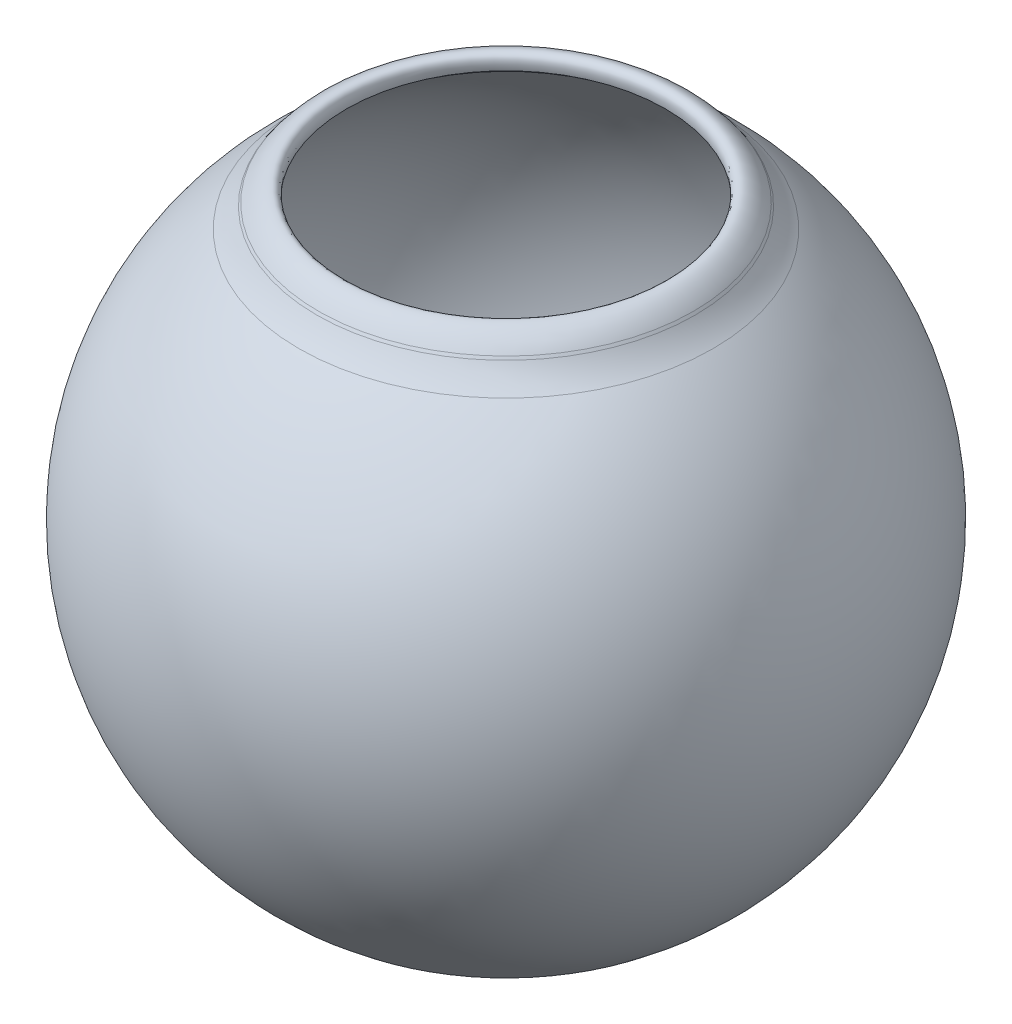
ISO-10303-21;
HEADER;
FILE_DESCRIPTION(('STEP AP214'),'2;1');
FILE_NAME('part.step','',(''),(''),'','','');
FILE_SCHEMA(('AUTOMOTIVE_DESIGN { 1 0 10303 214 1 1 1 1 }'));
ENDSEC;
DATA;
#1=APPLICATION_CONTEXT('core data for automotive mechanical design processes');
#2=APPLICATION_PROTOCOL_DEFINITION('international standard','automotive_design',2000,#1);
#3=PRODUCT_CONTEXT('',#1,'mechanical');
#4=PRODUCT('Part','Part','',(#3));
#5=PRODUCT_RELATED_PRODUCT_CATEGORY('part','',(#4));
#6=PRODUCT_DEFINITION_FORMATION('','',#4);
#7=PRODUCT_DEFINITION_CONTEXT('part definition',#1,'design');
#8=PRODUCT_DEFINITION('design','',#6,#7);
#9=PRODUCT_DEFINITION_SHAPE('','',#8);
#10=(LENGTH_UNIT() NAMED_UNIT(*) SI_UNIT(.MILLI.,.METRE.));
#11=(NAMED_UNIT(*) PLANE_ANGLE_UNIT() SI_UNIT($,.RADIAN.));
#12=(NAMED_UNIT(*) SI_UNIT($,.STERADIAN.) SOLID_ANGLE_UNIT());
#13=UNCERTAINTY_MEASURE_WITH_UNIT(LENGTH_MEASURE(1.E-05),#10,'distance_accuracy_value','');
#14=(GEOMETRIC_REPRESENTATION_CONTEXT(3) GLOBAL_UNCERTAINTY_ASSIGNED_CONTEXT((#13)) GLOBAL_UNIT_ASSIGNED_CONTEXT((#10,
#11,#12)) REPRESENTATION_CONTEXT('',''));
#15=CARTESIAN_POINT('',(0.,0.,0.));
#16=DIRECTION('',(0.,0.,1.));
#17=DIRECTION('',(1.,0.,0.));
#18=AXIS2_PLACEMENT_3D('',#15,#16,#17);
#19=CARTESIAN_POINT('',(5.54815363193916,4.33606060606061,0.));
#20=CARTESIAN_POINT('',(5.40298248991348,5.04493347683729,0.));
#21=CARTESIAN_POINT('',(6.05134321620451,4.92625791000506,0.));
#22=CARTESIAN_POINT('',(6.52085883914075,4.28,0.));
#23=B_SPLINE_CURVE_WITH_KNOTS('',3,(#19,#20,#21,#22),.UNSPECIFIED.,.F.,.F.,(4,4),(0.,1.),.UNSPECIFIED.);
#24=CARTESIAN_POINT('',(0.,6.398313168269,0.));
#25=DIRECTION('',(0.,1.,0.));
#26=AXIS1_PLACEMENT('',#24,#25);
#27=SURFACE_OF_REVOLUTION('',#23,#26);
#28=CARTESIAN_POINT('',(0.,4.28,0.));
#29=DIRECTION('',(0.,1.,0.));
#30=DIRECTION('',(0.,0.,1.));
#31=AXIS2_PLACEMENT_3D('',#28,#29,#30);
#32=CIRCLE('',#31,6.52085883914075);
#33=CARTESIAN_POINT('',(6.52085883914075,4.28,0.));
#34=VERTEX_POINT('',#33);
#35=EDGE_CURVE('E56',#34,#34,#32,.T.);
#36=ORIENTED_EDGE('',*,*,#35,.T.);
#37=EDGE_LOOP('',(#36));
#38=FACE_BOUND('',#37,.T.);
#39=CARTESIAN_POINT('',(0.,4.33606060606061,0.));
#40=DIRECTION('',(0.,1.,0.));
#41=DIRECTION('',(0.,0.,1.));
#42=AXIS2_PLACEMENT_3D('',#39,#40,#41);
#43=CIRCLE('',#42,5.54815363193916);
#44=CARTESIAN_POINT('',(0.,4.33606060606061,5.54815363193916));
#45=VERTEX_POINT('',#44);
#46=EDGE_CURVE('E10',#45,#45,#43,.T.);
#47=ORIENTED_EDGE('',*,*,#46,.F.);
#48=EDGE_LOOP('',(#47));
#49=FACE_BOUND('',#48,.T.);
#50=ADVANCED_FACE('F33',(#38,#49),#27,.F.);
#51=CARTESIAN_POINT('',(0.,4.33606060606061,0.));
#52=DIRECTION('',(0.,-1.,0.));
#53=DIRECTION('',(0.,0.,-1.));
#54=AXIS2_PLACEMENT_3D('',#51,#52,#53);
#55=CONICAL_SURFACE('',#54,5.54815363193916,0.92242128572847);
#56=CARTESIAN_POINT('',(0.,4.07999999999923,0.));
#57=DIRECTION('',(0.,1.,0.));
#58=DIRECTION('',(0.,0.,1.));
#59=AXIS2_PLACEMENT_3D('',#56,#57,#58);
#60=CIRCLE('',#59,5.8861234016712);
#61=CARTESIAN_POINT('',(0.,4.07999999999923,5.8861234016712));
#62=VERTEX_POINT('',#61);
#63=EDGE_CURVE('E40',#62,#62,#60,.T.);
#64=ORIENTED_EDGE('',*,*,#63,.F.);
#65=EDGE_LOOP('',(#64));
#66=FACE_BOUND('',#65,.T.);
#67=ORIENTED_EDGE('',*,*,#46,.T.);
#68=EDGE_LOOP('',(#67));
#69=FACE_BOUND('',#68,.T.);
#70=ADVANCED_FACE('F91',(#66,#69),#55,.F.);
#71=CARTESIAN_POINT('',(0.,4.07999999999923,0.));
#72=DIRECTION('',(0.,-1.,0.));
#73=DIRECTION('',(0.,0.,-1.));
#74=AXIS2_PLACEMENT_3D('',#71,#72,#73);
#75=CONICAL_SURFACE('',#74,5.8861234016712,0.976703062621491);
#76=CARTESIAN_POINT('',(0.,3.69256208874024,0.));
#77=DIRECTION('',(0.,1.,0.));
#78=DIRECTION('',(0.,0.,1.));
#79=AXIS2_PLACEMENT_3D('',#76,#77,#78);
#80=CIRCLE('',#79,6.45968041012119);
#81=CARTESIAN_POINT('',(0.,3.69256208874024,6.45968041012119));
#82=VERTEX_POINT('',#81);
#83=EDGE_CURVE('E44',#82,#82,#80,.T.);
#84=ORIENTED_EDGE('',*,*,#83,.F.);
#85=EDGE_LOOP('',(#84));
#86=FACE_BOUND('',#85,.T.);
#87=ORIENTED_EDGE('',*,*,#63,.T.);
#88=EDGE_LOOP('',(#87));
#89=FACE_BOUND('',#88,.T.);
#90=ADVANCED_FACE('F87',(#86,#89),#75,.F.);
#91=CARTESIAN_POINT('',(0.,-5.20489802409883,0.));
#92=DIRECTION('',(0.,1.,0.));
#93=DIRECTION('',(1.,0.,0.));
#94=AXIS2_PLACEMENT_3D('',#91,#92,#93);
#95=SPHERICAL_SURFACE('',#94,10.9951019759012);
#96=ORIENTED_EDGE('',*,*,#83,.T.);
#97=EDGE_LOOP('',(#96));
#98=FACE_BOUND('',#97,.T.);
#99=ADVANCED_FACE('F82',(#98),#95,.F.);
#100=CARTESIAN_POINT('',(0.,-5.22,0.));
#101=DIRECTION('',(0.,1.,0.));
#102=DIRECTION('',(-1.,0.,0.));
#103=AXIS2_PLACEMENT_3D('',#100,#101,#102);
#104=SPHERICAL_SURFACE('',#103,11.3);
#105=CARTESIAN_POINT('',(0.,3.49186614152132,0.));
#106=DIRECTION('',(0.,1.,0.));
#107=DIRECTION('',(0.,0.,1.));
#108=AXIS2_PLACEMENT_3D('',#105,#106,#107);
#109=CIRCLE('',#108,7.19676235068343);
#110=CARTESIAN_POINT('',(0.,3.49186614152132,7.19676235068343));
#111=VERTEX_POINT('',#110);
#112=EDGE_CURVE('E48',#111,#111,#109,.T.);
#113=ORIENTED_EDGE('',*,*,#112,.F.);
#114=EDGE_LOOP('',(#113));
#115=FACE_BOUND('',#114,.T.);
#116=ADVANCED_FACE('F77',(#115),#104,.T.);
#117=CARTESIAN_POINT('',(0.,5.80475095785442,0.));
#118=DIRECTION('',(0.,1.,0.));
#119=DIRECTION('',(0.,0.,1.));
#120=AXIS2_PLACEMENT_3D('',#117,#118,#119);
#121=TOROIDAL_SURFACE('',#120,9.10740722254628,3.);
#122=CARTESIAN_POINT('',(0.,4.19232013622819,0.));
#123=DIRECTION('',(0.,1.,0.));
#124=DIRECTION('',(0.,0.,1.));
#125=AXIS2_PLACEMENT_3D('',#122,#123,#124);
#126=CIRCLE('',#125,6.57757188295009);
#127=CARTESIAN_POINT('',(6.57757188295009,4.19232013622819,0.));
#128=VERTEX_POINT('',#127);
#129=EDGE_CURVE('E53',#128,#128,#126,.T.);
#130=ORIENTED_EDGE('',*,*,#129,.F.);
#131=EDGE_LOOP('',(#130));
#132=FACE_BOUND('',#131,.T.);
#133=ORIENTED_EDGE('',*,*,#112,.T.);
#134=EDGE_LOOP('',(#133));
#135=FACE_BOUND('',#134,.T.);
#136=ADVANCED_FACE('F71',(#132,#135),#121,.F.);
#137=CARTESIAN_POINT('',(0.,0.,0.));
#138=DIRECTION('',(0.,1.,0.));
#139=DIRECTION('',(1.,0.,0.));
#140=AXIS2_PLACEMENT_3D('',#137,#138,#139);
#141=SPHERICAL_SURFACE('',#140,7.8);
#142=CARTESIAN_POINT('',(6.52085883914075,4.28,0.));
#143=CARTESIAN_POINT('',(6.52145570487089,4.27909063617475,0.));
#144=CARTESIAN_POINT('',(6.52205238037854,4.27818114749597,0.));
#145=CARTESIAN_POINT('',(6.52324535084448,4.27636192059057,0.));
#146=CARTESIAN_POINT('',(6.52384164580277,4.27545218236395,0.));
#147=CARTESIAN_POINT('',(6.5250338550656,4.27363245652209,0.));
#148=CARTESIAN_POINT('',(6.52562976937015,4.27272246890684,0.));
#149=CARTESIAN_POINT('',(6.5268212172212,4.27090224444701,0.));
#150=CARTESIAN_POINT('',(6.5274167507677,4.26999200760242,0.));
#151=CARTESIAN_POINT('',(6.52860743699842,4.26817128484321,0.));
#152=CARTESIAN_POINT('',(6.52920258968265,4.26726079892859,0.));
#153=CARTESIAN_POINT('',(6.53039251408465,4.26543957818869,0.));
#154=CARTESIAN_POINT('',(6.53098728580242,4.2645288433634,0.));
#155=CARTESIAN_POINT('',(6.53217644816743,4.26270712496156,0.));
#156=CARTESIAN_POINT('',(6.53277083881466,4.26179614138501,0.));
#157=CARTESIAN_POINT('',(6.53395923893453,4.25997392564009,0.));
#158=CARTESIAN_POINT('',(6.53455324840717,4.25906269347172,0.));
#159=CARTESIAN_POINT('',(6.5357408860739,4.25723998070266,0.));
#160=CARTESIAN_POINT('',(6.53633451426799,4.25632850010197,0.));
#161=CARTESIAN_POINT('',(6.53752138927372,4.25450529062779,0.));
#162=CARTESIAN_POINT('',(6.53811463608536,4.25359356175431,0.));
#163=CARTESIAN_POINT('',(6.53930074822234,4.25176985589413,0.));
#164=CARTESIAN_POINT('',(6.53989361354769,4.25085787890744,0.));
#165=CARTESIAN_POINT('',(6.54107896260832,4.24903367698046,0.));
#166=CARTESIAN_POINT('',(6.54167144634361,4.24812145204018,0.));
#167=CARTESIAN_POINT('',(6.54285603212043,4.24629675436569,0.));
#168=CARTESIAN_POINT('',(6.54344813416196,4.24538428163148,0.));
#169=CARTESIAN_POINT('',(6.54463195644763,4.24355908852885,0.));
#170=CARTESIAN_POINT('',(6.54522367669176,4.24264636816042,0.));
#171=CARTESIAN_POINT('',(6.54640673527908,4.24082067994911,0.));
#172=CARTESIAN_POINT('',(6.54699807362225,4.23990771210622,0.));
#173=CARTESIAN_POINT('',(6.54818036830414,4.23808152910577,0.));
#174=CARTESIAN_POINT('',(6.54877132464285,4.23716831394822,0.));
#175=CARTESIAN_POINT('',(6.54995285521238,4.23534163647827,0.));
#176=CARTESIAN_POINT('',(6.5505434294432,4.23442817416588,0.));
#177=CARTESIAN_POINT('',(6.55172419569357,4.23260100254616,0.));
#178=CARTESIAN_POINT('',(6.55231438771312,4.23168729323882,0.));
#179=CARTESIAN_POINT('',(6.55349438943766,4.22985962778912,0.));
#180=CARTESIAN_POINT('',(6.55408419914265,4.22894567164676,0.));
#181=CARTESIAN_POINT('',(6.55526343613483,4.22711751268699,0.));
#182=CARTESIAN_POINT('',(6.55585286342203,4.22620330986957,0.));
#183=CARTESIAN_POINT('',(6.55703133547545,4.22437465771969,0.));
#184=CARTESIAN_POINT('',(6.55762038024167,4.22346020838723,0.));
#185=CARTESIAN_POINT('',(6.55879808715007,4.22163106336732,0.));
#186=CARTESIAN_POINT('',(6.55938674929223,4.22071636767987,0.));
#187=CARTESIAN_POINT('',(6.56056369084946,4.21888673011008,0.));
#188=CARTESIAN_POINT('',(6.56115197026453,4.21797178822774,0.));
#189=CARTESIAN_POINT('',(6.56232814626461,4.2161416584283,0.));
#190=CARTESIAN_POINT('',(6.56291604284962,4.21522647051121,0.));
#191=CARTESIAN_POINT('',(6.56409145308668,4.21339584880245,0.));
#192=CARTESIAN_POINT('',(6.56467896673872,4.21248041501079,0.));
#193=CARTESIAN_POINT('',(6.56585361100703,4.21064930171313,0.));
#194=CARTESIAN_POINT('',(6.56644074162328,4.20973362220713,0.));
#195=CARTESIAN_POINT('',(6.56761461971724,4.20790201764105,0.));
#196=CARTESIAN_POINT('',(6.56820136719494,4.20698609258098,0.));
#197=CARTESIAN_POINT('',(6.56937447890909,4.20515399706708,0.));
#198=CARTESIAN_POINT('',(6.56996084314554,4.20423782661324,0.));
#199=CARTESIAN_POINT('',(6.57113318827455,4.20240524047218,0.));
#200=CARTESIAN_POINT('',(6.57171916916711,4.20148882478495,0.));
#201=CARTESIAN_POINT('',(6.5728907475058,4.19965574833747,0.));
#202=CARTESIAN_POINT('',(6.57347634495191,4.19873908757724,0.));
#203=CARTESIAN_POINT('',(6.5746471562952,4.1969055211442,0.));
#204=CARTESIAN_POINT('',(6.57523237019238,4.1959886154714,0.));
#205=CARTESIAN_POINT('',(6.57640241433536,4.19415455937372,0.));
#206=CARTESIAN_POINT('',(6.57698724458117,4.19323740894885,0.));
#207=CARTESIAN_POINT('',(6.57757188295009,4.19232013622819,0.));
#208=B_SPLINE_CURVE_WITH_KNOTS('',3,(#142,#143,#144,#145,#146,#147,#148,#149,#150,#151,#152,
#153,#154,#155,#156,#157,#158,#159,#160,#161,#162,#163,#164,#165,#166,#167,#168,#169,#170,#171,
#172,#173,#174,#175,#176,#177,#178,#179,#180,#181,#182,#183,#184,#185,#186,#187,#188,#189,#190,
#191,#192,#193,#194,#195,#196,#197,#198,#199,#200,#201,#202,#203,#204,#205,#206,#207),
.UNSPECIFIED.,.F.,.F.,(4,2,2,2,2,2,2,2,2,2,2,2,2,2,2,2,2,2,2,2,2,2,2,2,2,2,2,2,2,2,2,2,4),(0.,
0.00326323784653352,0.00652647569306635,0.00978971353959981,0.0130529513861325,
0.0163161892326661,0.0195794270791985,0.0228426649257315,0.0261059027722647,0.0293691406187976,
0.0326323784653306,0.0358956163118646,0.0391588541583965,0.0424220920049299,0.0456853298514641,
0.0489485676979967,0.05221180554453,0.0554750433910632,0.0587382812375956,0.0620015190841293,
0.0652647569306621,0.0685279947771956,0.0717912326237277,0.0750544704702609,0.0783177083167942,
0.081580946163328,0.084844184009861,0.0881074218563942,0.0913706597029263,0.0946338975494594,
0.0978971353959933,0.101160373242527,0.104423611089059),.UNSPECIFIED.);
#209=EDGE_CURVE('BSEAM68',#34,#128,#208,.T.);
#210=ORIENTED_EDGE('',*,*,#35,.F.);
#211=ORIENTED_EDGE('',*,*,#129,.T.);
#212=ORIENTED_EDGE('',*,*,#209,.T.);
#213=ORIENTED_EDGE('',*,*,#209,.F.);
#214=EDGE_LOOP('',(#210,#212,#211,#213));
#215=FACE_BOUND('',#214,.T.);
#216=ADVANCED_FACE('F68',(#215),#141,.T.);
#217=CLOSED_SHELL('',(#50,#70,#90,#99,#116,#136,#216));
#218=MANIFOLD_SOLID_BREP('B2',#217);
#219=ADVANCED_BREP_SHAPE_REPRESENTATION('',(#18,#218),#14);
#220=SHAPE_DEFINITION_REPRESENTATION(#9,#219);
ENDSEC;
END-ISO-10303-21;
